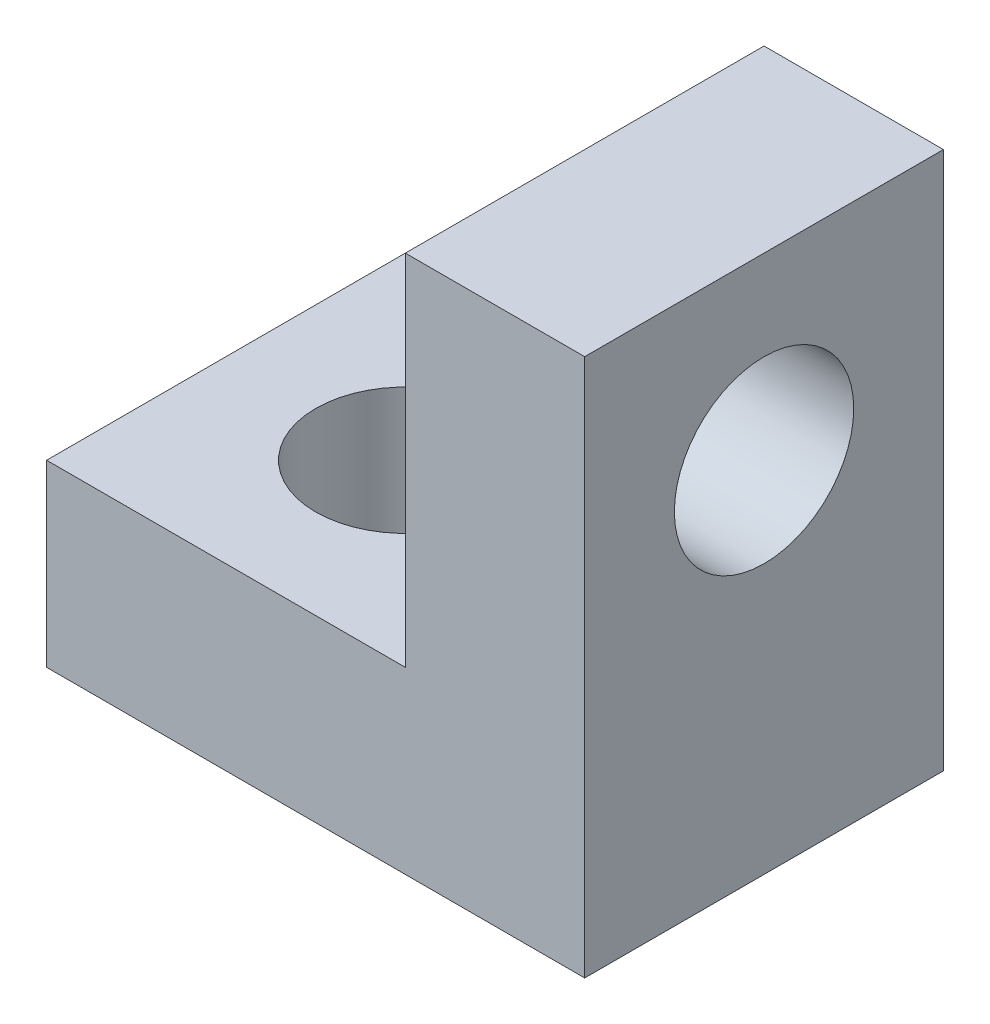
ISO-10303-21;
HEADER;
FILE_DESCRIPTION(('STEP AP214'),'2;1');
FILE_NAME('part.step','',(''),(''),'','','');
FILE_SCHEMA(('AUTOMOTIVE_DESIGN { 1 0 10303 214 1 1 1 1 }'));
ENDSEC;
DATA;
#1=APPLICATION_CONTEXT('core data for automotive mechanical design processes');
#2=APPLICATION_PROTOCOL_DEFINITION('international standard','automotive_design',2000,#1);
#3=PRODUCT_CONTEXT('',#1,'mechanical');
#4=PRODUCT('Part','Part','',(#3));
#5=PRODUCT_RELATED_PRODUCT_CATEGORY('part','',(#4));
#6=PRODUCT_DEFINITION_FORMATION('','',#4);
#7=PRODUCT_DEFINITION_CONTEXT('part definition',#1,'design');
#8=PRODUCT_DEFINITION('design','',#6,#7);
#9=PRODUCT_DEFINITION_SHAPE('','',#8);
#10=(LENGTH_UNIT() NAMED_UNIT(*) SI_UNIT(.MILLI.,.METRE.));
#11=(NAMED_UNIT(*) PLANE_ANGLE_UNIT() SI_UNIT($,.RADIAN.));
#12=(NAMED_UNIT(*) SI_UNIT($,.STERADIAN.) SOLID_ANGLE_UNIT());
#13=UNCERTAINTY_MEASURE_WITH_UNIT(LENGTH_MEASURE(1.E-05),#10,'distance_accuracy_value','');
#14=(GEOMETRIC_REPRESENTATION_CONTEXT(3) GLOBAL_UNCERTAINTY_ASSIGNED_CONTEXT((#13)) GLOBAL_UNIT_ASSIGNED_CONTEXT((#10,
#11,#12)) REPRESENTATION_CONTEXT('',''));
#15=CARTESIAN_POINT('',(0.,0.,0.));
#16=DIRECTION('',(0.,0.,1.));
#17=DIRECTION('',(1.,0.,0.));
#18=AXIS2_PLACEMENT_3D('',#15,#16,#17);
#19=CARTESIAN_POINT('',(0.,0.,10.));
#20=DIRECTION('',(0.,0.,1.));
#21=DIRECTION('',(1.,0.,0.));
#22=AXIS2_PLACEMENT_3D('',#19,#20,#21);
#23=PLANE('',#22);
#24=DIRECTION('',(0.,1.,0.));
#25=VECTOR('',#24,1.);
#26=CARTESIAN_POINT('',(0.,-5.,10.));
#27=LINE('',#26,#25);
#28=CARTESIAN_POINT('',(0.,-5.,10.));
#29=VERTEX_POINT('',#28);
#30=CARTESIAN_POINT('',(0.,0.,10.));
#31=VERTEX_POINT('',#30);
#32=EDGE_CURVE('E52',#29,#31,#27,.T.);
#33=ORIENTED_EDGE('',*,*,#32,.F.);
#34=DIRECTION('',(-1.,0.,0.));
#35=VECTOR('',#34,1.);
#36=CARTESIAN_POINT('',(15.,-5.,10.));
#37=LINE('',#36,#35);
#38=CARTESIAN_POINT('',(15.,-5.,10.));
#39=VERTEX_POINT('',#38);
#40=EDGE_CURVE('E73',#39,#29,#37,.T.);
#41=ORIENTED_EDGE('',*,*,#40,.F.);
#42=DIRECTION('',(0.,-1.,0.));
#43=VECTOR('',#42,1.);
#44=CARTESIAN_POINT('',(15.,10.,10.));
#45=LINE('',#44,#43);
#46=CARTESIAN_POINT('',(15.,10.,10.));
#47=VERTEX_POINT('',#46);
#48=EDGE_CURVE('E82',#47,#39,#45,.T.);
#49=ORIENTED_EDGE('',*,*,#48,.F.);
#50=DIRECTION('',(1.,0.,0.));
#51=VECTOR('',#50,1.);
#52=CARTESIAN_POINT('',(10.,10.,10.));
#53=LINE('',#52,#51);
#54=CARTESIAN_POINT('',(10.,10.,10.));
#55=VERTEX_POINT('',#54);
#56=EDGE_CURVE('E89',#55,#47,#53,.T.);
#57=ORIENTED_EDGE('',*,*,#56,.F.);
#58=DIRECTION('',(0.,1.,0.));
#59=VECTOR('',#58,1.);
#60=CARTESIAN_POINT('',(10.,0.,10.));
#61=LINE('',#60,#59);
#62=CARTESIAN_POINT('',(10.,0.,10.));
#63=VERTEX_POINT('',#62);
#64=EDGE_CURVE('E97',#63,#55,#61,.T.);
#65=ORIENTED_EDGE('',*,*,#64,.F.);
#66=DIRECTION('',(1.,0.,0.));
#67=VECTOR('',#66,1.);
#68=CARTESIAN_POINT('',(0.,0.,10.));
#69=LINE('',#68,#67);
#70=EDGE_CURVE('E128',#31,#63,#69,.T.);
#71=ORIENTED_EDGE('',*,*,#70,.F.);
#72=EDGE_LOOP('',(#33,#41,#49,#57,#65,#71));
#73=FACE_BOUND('',#72,.T.);
#74=ADVANCED_FACE('F42',(#73),#23,.T.);
#75=CARTESIAN_POINT('',(0.,0.,0.));
#76=DIRECTION('',(0.,0.,1.));
#77=DIRECTION('',(1.,0.,0.));
#78=AXIS2_PLACEMENT_3D('',#75,#76,#77);
#79=PLANE('',#78);
#80=DIRECTION('',(0.,1.,0.));
#81=VECTOR('',#80,1.);
#82=CARTESIAN_POINT('',(0.,-5.,0.));
#83=LINE('',#82,#81);
#84=CARTESIAN_POINT('',(0.,-5.,0.));
#85=VERTEX_POINT('',#84);
#86=CARTESIAN_POINT('',(0.,0.,0.));
#87=VERTEX_POINT('',#86);
#88=EDGE_CURVE('E12',#85,#87,#83,.T.);
#89=ORIENTED_EDGE('',*,*,#88,.T.);
#90=DIRECTION('',(1.,0.,0.));
#91=VECTOR('',#90,1.);
#92=CARTESIAN_POINT('',(0.,0.,0.));
#93=LINE('',#92,#91);
#94=CARTESIAN_POINT('',(10.,0.,0.));
#95=VERTEX_POINT('',#94);
#96=EDGE_CURVE('E124',#87,#95,#93,.T.);
#97=ORIENTED_EDGE('',*,*,#96,.T.);
#98=DIRECTION('',(0.,1.,0.));
#99=VECTOR('',#98,1.);
#100=CARTESIAN_POINT('',(10.,0.,0.));
#101=LINE('',#100,#99);
#102=CARTESIAN_POINT('',(10.,10.,0.));
#103=VERTEX_POINT('',#102);
#104=EDGE_CURVE('E112',#95,#103,#101,.T.);
#105=ORIENTED_EDGE('',*,*,#104,.T.);
#106=DIRECTION('',(1.,0.,0.));
#107=VECTOR('',#106,1.);
#108=CARTESIAN_POINT('',(10.,10.,0.));
#109=LINE('',#108,#107);
#110=CARTESIAN_POINT('',(15.,10.,0.));
#111=VERTEX_POINT('',#110);
#112=EDGE_CURVE('E108',#103,#111,#109,.T.);
#113=ORIENTED_EDGE('',*,*,#112,.T.);
#114=DIRECTION('',(0.,-1.,0.));
#115=VECTOR('',#114,1.);
#116=CARTESIAN_POINT('',(15.,10.,0.));
#117=LINE('',#116,#115);
#118=CARTESIAN_POINT('',(15.,-5.,0.));
#119=VERTEX_POINT('',#118);
#120=EDGE_CURVE('E105',#111,#119,#117,.T.);
#121=ORIENTED_EDGE('',*,*,#120,.T.);
#122=DIRECTION('',(-1.,0.,0.));
#123=VECTOR('',#122,1.);
#124=CARTESIAN_POINT('',(15.,-5.,0.));
#125=LINE('',#124,#123);
#126=EDGE_CURVE('E179',#119,#85,#125,.T.);
#127=ORIENTED_EDGE('',*,*,#126,.T.);
#128=EDGE_LOOP('',(#89,#97,#105,#113,#121,#127));
#129=FACE_BOUND('',#128,.T.);
#130=ADVANCED_FACE('F240',(#129),#79,.F.);
#131=CARTESIAN_POINT('',(15.,-5.,0.));
#132=DIRECTION('',(0.,1.,0.));
#133=DIRECTION('',(-1.,0.,0.));
#134=AXIS2_PLACEMENT_3D('',#131,#132,#133);
#135=PLANE('',#134);
#136=CARTESIAN_POINT('',(5.,-5.,5.));
#137=DIRECTION('',(0.,1.,0.));
#138=DIRECTION('',(0.,0.,1.));
#139=AXIS2_PLACEMENT_3D('',#136,#137,#138);
#140=CIRCLE('',#139,2.5);
#141=CARTESIAN_POINT('',(5.,-5.,7.5));
#142=VERTEX_POINT('',#141);
#143=EDGE_CURVE('E209',#142,#142,#140,.T.);
#144=ORIENTED_EDGE('',*,*,#143,.T.);
#145=EDGE_LOOP('',(#144));
#146=FACE_BOUND('',#145,.T.);
#147=ORIENTED_EDGE('',*,*,#40,.T.);
#148=DIRECTION('',(0.,0.,1.));
#149=VECTOR('',#148,1.);
#150=CARTESIAN_POINT('',(0.,-5.,0.));
#151=LINE('',#150,#149);
#152=EDGE_CURVE('E120',#85,#29,#151,.T.);
#153=ORIENTED_EDGE('',*,*,#152,.F.);
#154=ORIENTED_EDGE('',*,*,#126,.F.);
#155=DIRECTION('',(0.,0.,1.));
#156=VECTOR('',#155,1.);
#157=CARTESIAN_POINT('',(15.,-5.,0.));
#158=LINE('',#157,#156);
#159=EDGE_CURVE('E177',#119,#39,#158,.T.);
#160=ORIENTED_EDGE('',*,*,#159,.T.);
#161=EDGE_LOOP('',(#147,#153,#154,#160));
#162=FACE_BOUND('',#161,.T.);
#163=ADVANCED_FACE('F219',(#146,#162),#135,.F.);
#164=CARTESIAN_POINT('',(15.,10.,0.));
#165=DIRECTION('',(-1.,0.,0.));
#166=DIRECTION('',(0.,-1.,0.));
#167=AXIS2_PLACEMENT_3D('',#164,#165,#166);
#168=PLANE('',#167);
#169=CARTESIAN_POINT('',(15.,5.,5.));
#170=DIRECTION('',(-1.,0.,0.));
#171=DIRECTION('',(0.,0.,1.));
#172=AXIS2_PLACEMENT_3D('',#169,#170,#171);
#173=CIRCLE('',#172,2.5);
#174=CARTESIAN_POINT('',(15.,5.,7.5));
#175=VERTEX_POINT('',#174);
#176=EDGE_CURVE('E184',#175,#175,#173,.T.);
#177=ORIENTED_EDGE('',*,*,#176,.T.);
#178=EDGE_LOOP('',(#177));
#179=FACE_BOUND('',#178,.T.);
#180=ORIENTED_EDGE('',*,*,#48,.T.);
#181=ORIENTED_EDGE('',*,*,#159,.F.);
#182=ORIENTED_EDGE('',*,*,#120,.F.);
#183=DIRECTION('',(0.,0.,1.));
#184=VECTOR('',#183,1.);
#185=CARTESIAN_POINT('',(15.,10.,0.));
#186=LINE('',#185,#184);
#187=EDGE_CURVE('E165',#111,#47,#186,.T.);
#188=ORIENTED_EDGE('',*,*,#187,.T.);
#189=EDGE_LOOP('',(#180,#181,#182,#188));
#190=FACE_BOUND('',#189,.T.);
#191=ADVANCED_FACE('F247',(#179,#190),#168,.F.);
#192=CARTESIAN_POINT('',(10.,10.,0.));
#193=DIRECTION('',(0.,-1.,0.));
#194=DIRECTION('',(0.,0.,-1.));
#195=AXIS2_PLACEMENT_3D('',#192,#193,#194);
#196=PLANE('',#195);
#197=ORIENTED_EDGE('',*,*,#56,.T.);
#198=ORIENTED_EDGE('',*,*,#187,.F.);
#199=ORIENTED_EDGE('',*,*,#112,.F.);
#200=DIRECTION('',(0.,0.,1.));
#201=VECTOR('',#200,1.);
#202=CARTESIAN_POINT('',(10.,10.,0.));
#203=LINE('',#202,#201);
#204=EDGE_CURVE('E152',#103,#55,#203,.T.);
#205=ORIENTED_EDGE('',*,*,#204,.T.);
#206=EDGE_LOOP('',(#197,#198,#199,#205));
#207=FACE_BOUND('',#206,.T.);
#208=ADVANCED_FACE('F236',(#207),#196,.F.);
#209=CARTESIAN_POINT('',(10.,0.,0.));
#210=DIRECTION('',(1.,0.,0.));
#211=DIRECTION('',(0.,0.,-1.));
#212=AXIS2_PLACEMENT_3D('',#209,#210,#211);
#213=PLANE('',#212);
#214=CARTESIAN_POINT('',(10.,5.,5.));
#215=DIRECTION('',(-1.,0.,0.));
#216=DIRECTION('',(0.,0.,1.));
#217=AXIS2_PLACEMENT_3D('',#214,#215,#216);
#218=CIRCLE('',#217,2.5);
#219=CARTESIAN_POINT('',(10.,5.,7.5));
#220=VERTEX_POINT('',#219);
#221=EDGE_CURVE('E188',#220,#220,#218,.T.);
#222=ORIENTED_EDGE('',*,*,#221,.F.);
#223=EDGE_LOOP('',(#222));
#224=FACE_BOUND('',#223,.T.);
#225=ORIENTED_EDGE('',*,*,#64,.T.);
#226=ORIENTED_EDGE('',*,*,#204,.F.);
#227=ORIENTED_EDGE('',*,*,#104,.F.);
#228=DIRECTION('',(0.,0.,1.));
#229=VECTOR('',#228,1.);
#230=CARTESIAN_POINT('',(10.,0.,0.));
#231=LINE('',#230,#229);
#232=EDGE_CURVE('E135',#95,#63,#231,.T.);
#233=ORIENTED_EDGE('',*,*,#232,.T.);
#234=EDGE_LOOP('',(#225,#226,#227,#233));
#235=FACE_BOUND('',#234,.T.);
#236=ADVANCED_FACE('F229',(#224,#235),#213,.F.);
#237=CARTESIAN_POINT('',(0.,0.,0.));
#238=DIRECTION('',(0.,-1.,0.));
#239=DIRECTION('',(0.,0.,-1.));
#240=AXIS2_PLACEMENT_3D('',#237,#238,#239);
#241=PLANE('',#240);
#242=CARTESIAN_POINT('',(5.,0.,5.));
#243=DIRECTION('',(0.,1.,0.));
#244=DIRECTION('',(0.,0.,1.));
#245=AXIS2_PLACEMENT_3D('',#242,#243,#244);
#246=CIRCLE('',#245,2.5);
#247=CARTESIAN_POINT('',(5.,0.,7.5));
#248=VERTEX_POINT('',#247);
#249=EDGE_CURVE('E211',#248,#248,#246,.T.);
#250=ORIENTED_EDGE('',*,*,#249,.F.);
#251=EDGE_LOOP('',(#250));
#252=FACE_BOUND('',#251,.T.);
#253=ORIENTED_EDGE('',*,*,#70,.T.);
#254=ORIENTED_EDGE('',*,*,#232,.F.);
#255=ORIENTED_EDGE('',*,*,#96,.F.);
#256=DIRECTION('',(0.,0.,1.));
#257=VECTOR('',#256,1.);
#258=CARTESIAN_POINT('',(0.,0.,0.));
#259=LINE('',#258,#257);
#260=EDGE_CURVE('E119',#87,#31,#259,.T.);
#261=ORIENTED_EDGE('',*,*,#260,.T.);
#262=EDGE_LOOP('',(#253,#254,#255,#261));
#263=FACE_BOUND('',#262,.T.);
#264=ADVANCED_FACE('F127',(#252,#263),#241,.F.);
#265=CARTESIAN_POINT('',(0.,-5.,0.));
#266=DIRECTION('',(1.,0.,0.));
#267=DIRECTION('',(0.,0.,-1.));
#268=AXIS2_PLACEMENT_3D('',#265,#266,#267);
#269=PLANE('',#268);
#270=ORIENTED_EDGE('',*,*,#32,.T.);
#271=ORIENTED_EDGE('',*,*,#260,.F.);
#272=ORIENTED_EDGE('',*,*,#88,.F.);
#273=ORIENTED_EDGE('',*,*,#152,.T.);
#274=EDGE_LOOP('',(#270,#271,#272,#273));
#275=FACE_BOUND('',#274,.T.);
#276=ADVANCED_FACE('F118',(#275),#269,.F.);
#277=CARTESIAN_POINT('',(15.,5.,5.));
#278=DIRECTION('',(-1.,0.,0.));
#279=DIRECTION('',(0.,0.,1.));
#280=AXIS2_PLACEMENT_3D('',#277,#278,#279);
#281=CYLINDRICAL_SURFACE('',#280,2.5);
#282=ORIENTED_EDGE('',*,*,#176,.F.);
#283=EDGE_LOOP('',(#282));
#284=FACE_BOUND('',#283,.T.);
#285=ORIENTED_EDGE('',*,*,#221,.T.);
#286=EDGE_LOOP('',(#285));
#287=FACE_BOUND('',#286,.T.);
#288=ADVANCED_FACE('F224',(#284,#287),#281,.F.);
#289=CARTESIAN_POINT('',(5.,-5.,5.));
#290=DIRECTION('',(0.,1.,0.));
#291=DIRECTION('',(0.,0.,1.));
#292=AXIS2_PLACEMENT_3D('',#289,#290,#291);
#293=CYLINDRICAL_SURFACE('',#292,2.5);
#294=ORIENTED_EDGE('',*,*,#143,.F.);
#295=EDGE_LOOP('',(#294));
#296=FACE_BOUND('',#295,.T.);
#297=ORIENTED_EDGE('',*,*,#249,.T.);
#298=EDGE_LOOP('',(#297));
#299=FACE_BOUND('',#298,.T.);
#300=ADVANCED_FACE('F221',(#296,#299),#293,.F.);
#301=CLOSED_SHELL('',(#74,#130,#163,#191,#208,#236,#264,#276,#288,#300));
#302=MANIFOLD_SOLID_BREP('B2',#301);
#303=ADVANCED_BREP_SHAPE_REPRESENTATION('',(#18,#302),#14);
#304=SHAPE_DEFINITION_REPRESENTATION(#9,#303);
ENDSEC;
END-ISO-10303-21;
